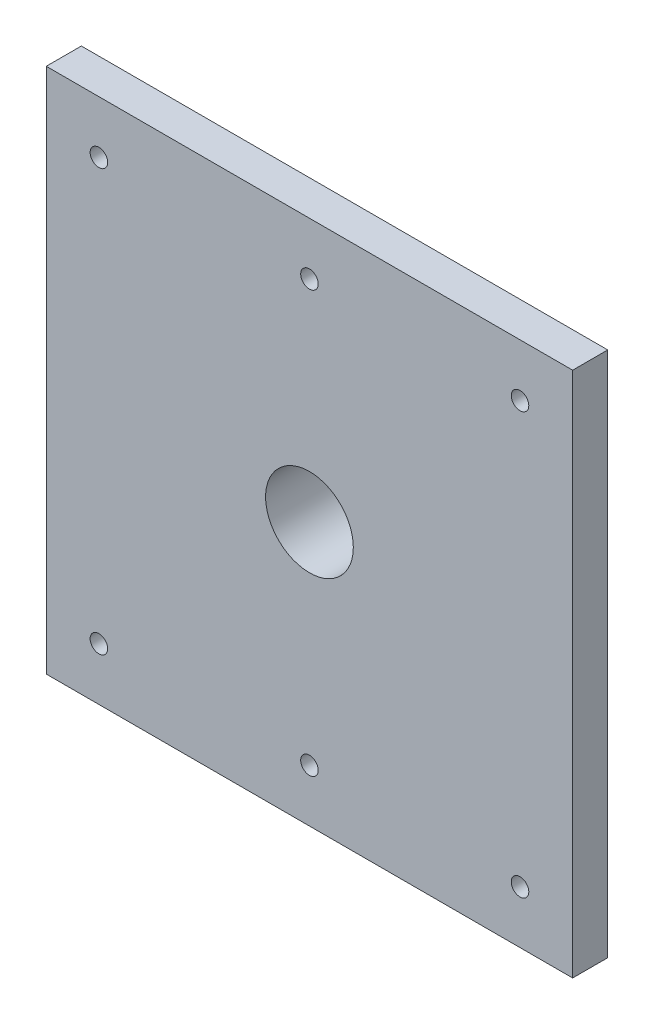
ISO-10303-21;
HEADER;
FILE_DESCRIPTION(('STEP AP214'),'2;1');
FILE_NAME('part.step','',(''),(''),'','','');
FILE_SCHEMA(('AUTOMOTIVE_DESIGN { 1 0 10303 214 1 1 1 1 }'));
ENDSEC;
DATA;
#1=APPLICATION_CONTEXT('core data for automotive mechanical design processes');
#2=APPLICATION_PROTOCOL_DEFINITION('international standard','automotive_design',2000,#1);
#3=PRODUCT_CONTEXT('',#1,'mechanical');
#4=PRODUCT('Part','Part','',(#3));
#5=PRODUCT_RELATED_PRODUCT_CATEGORY('part','',(#4));
#6=PRODUCT_DEFINITION_FORMATION('','',#4);
#7=PRODUCT_DEFINITION_CONTEXT('part definition',#1,'design');
#8=PRODUCT_DEFINITION('design','',#6,#7);
#9=PRODUCT_DEFINITION_SHAPE('','',#8);
#10=(LENGTH_UNIT() NAMED_UNIT(*) SI_UNIT(.MILLI.,.METRE.));
#11=(NAMED_UNIT(*) PLANE_ANGLE_UNIT() SI_UNIT($,.RADIAN.));
#12=(NAMED_UNIT(*) SI_UNIT($,.STERADIAN.) SOLID_ANGLE_UNIT());
#13=UNCERTAINTY_MEASURE_WITH_UNIT(LENGTH_MEASURE(1.E-05),#10,'distance_accuracy_value','');
#14=(GEOMETRIC_REPRESENTATION_CONTEXT(3) GLOBAL_UNCERTAINTY_ASSIGNED_CONTEXT((#13)) GLOBAL_UNIT_ASSIGNED_CONTEXT((#10,
#11,#12)) REPRESENTATION_CONTEXT('',''));
#15=CARTESIAN_POINT('',(0.,0.,0.));
#16=DIRECTION('',(0.,0.,1.));
#17=DIRECTION('',(1.,0.,0.));
#18=AXIS2_PLACEMENT_3D('',#15,#16,#17);
#19=CARTESIAN_POINT('',(0.,0.,-15.));
#20=DIRECTION('',(0.,0.,1.));
#21=DIRECTION('',(1.,0.,0.));
#22=AXIS2_PLACEMENT_3D('',#19,#20,#21);
#23=CYLINDRICAL_SURFACE('',#22,14.5);
#24=CARTESIAN_POINT('',(0.,0.,-15.));
#25=DIRECTION('',(0.,0.,1.));
#26=DIRECTION('',(1.,0.,0.));
#27=AXIS2_PLACEMENT_3D('',#24,#25,#26);
#28=CIRCLE('',#27,14.5);
#29=CARTESIAN_POINT('',(14.5,0.,-15.));
#30=VERTEX_POINT('',#29);
#31=EDGE_CURVE('E12',#30,#30,#28,.T.);
#32=ORIENTED_EDGE('',*,*,#31,.T.);
#33=EDGE_LOOP('',(#32));
#34=FACE_BOUND('',#33,.T.);
#35=CARTESIAN_POINT('',(0.,0.,0.));
#36=DIRECTION('',(0.,0.,1.));
#37=DIRECTION('',(1.,0.,0.));
#38=AXIS2_PLACEMENT_3D('',#35,#36,#37);
#39=CIRCLE('',#38,14.5);
#40=CARTESIAN_POINT('',(14.5,0.,0.));
#41=VERTEX_POINT('',#40);
#42=EDGE_CURVE('E45',#41,#41,#39,.T.);
#43=ORIENTED_EDGE('',*,*,#42,.F.);
#44=EDGE_LOOP('',(#43));
#45=FACE_BOUND('',#44,.T.);
#46=ADVANCED_FACE('F42',(#34,#45),#23,.T.);
#47=CARTESIAN_POINT('',(0.,0.,-15.));
#48=DIRECTION('',(0.,0.,1.));
#49=DIRECTION('',(1.,0.,0.));
#50=AXIS2_PLACEMENT_3D('',#47,#48,#49);
#51=PLANE('',#50);
#52=CARTESIAN_POINT('',(0.,0.,-15.));
#53=DIRECTION('',(0.,0.,1.));
#54=DIRECTION('',(1.,0.,0.));
#55=AXIS2_PLACEMENT_3D('',#52,#53,#54);
#56=CIRCLE('',#55,12.5);
#57=CARTESIAN_POINT('',(12.5,0.,-15.));
#58=VERTEX_POINT('',#57);
#59=EDGE_CURVE('E120',#58,#58,#56,.T.);
#60=ORIENTED_EDGE('',*,*,#59,.T.);
#61=EDGE_LOOP('',(#60));
#62=FACE_BOUND('',#61,.T.);
#63=ORIENTED_EDGE('',*,*,#31,.F.);
#64=EDGE_LOOP('',(#63));
#65=FACE_BOUND('',#64,.T.);
#66=ADVANCED_FACE('F131',(#62,#65),#51,.F.);
#67=CARTESIAN_POINT('',(0.,0.,-15.));
#68=DIRECTION('',(0.,0.,1.));
#69=DIRECTION('',(1.,0.,0.));
#70=AXIS2_PLACEMENT_3D('',#67,#68,#69);
#71=CYLINDRICAL_SURFACE('',#70,12.5);
#72=ORIENTED_EDGE('',*,*,#59,.F.);
#73=EDGE_LOOP('',(#72));
#74=FACE_BOUND('',#73,.T.);
#75=CARTESIAN_POINT('',(0.,0.,10.));
#76=DIRECTION('',(0.,0.,1.));
#77=DIRECTION('',(1.,0.,0.));
#78=AXIS2_PLACEMENT_3D('',#75,#76,#77);
#79=CIRCLE('',#78,12.5);
#80=CARTESIAN_POINT('',(12.5,0.,10.));
#81=VERTEX_POINT('',#80);
#82=EDGE_CURVE('E113',#81,#81,#79,.T.);
#83=ORIENTED_EDGE('',*,*,#82,.T.);
#84=EDGE_LOOP('',(#83));
#85=FACE_BOUND('',#84,.T.);
#86=ADVANCED_FACE('F136',(#74,#85),#71,.F.);
#87=CARTESIAN_POINT('',(0.,0.,10.));
#88=DIRECTION('',(0.,0.,-1.));
#89=DIRECTION('',(-1.,0.,0.));
#90=AXIS2_PLACEMENT_3D('',#87,#88,#89);
#91=PLANE('',#90);
#92=CARTESIAN_POINT('',(-60.,-60.,10.));
#93=DIRECTION('',(0.,0.,1.));
#94=DIRECTION('',(1.,0.,0.));
#95=AXIS2_PLACEMENT_3D('',#92,#93,#94);
#96=CIRCLE('',#95,2.5);
#97=CARTESIAN_POINT('',(-57.5,-60.,10.));
#98=VERTEX_POINT('',#97);
#99=EDGE_CURVE('E220',#98,#98,#96,.T.);
#100=ORIENTED_EDGE('',*,*,#99,.F.);
#101=EDGE_LOOP('',(#100));
#102=FACE_BOUND('',#101,.T.);
#103=CARTESIAN_POINT('',(0.,-60.,10.));
#104=DIRECTION('',(0.,0.,1.));
#105=DIRECTION('',(1.,0.,0.));
#106=AXIS2_PLACEMENT_3D('',#103,#104,#105);
#107=CIRCLE('',#106,2.5);
#108=CARTESIAN_POINT('',(2.5,-60.,10.));
#109=VERTEX_POINT('',#108);
#110=EDGE_CURVE('E214',#109,#109,#107,.T.);
#111=ORIENTED_EDGE('',*,*,#110,.F.);
#112=EDGE_LOOP('',(#111));
#113=FACE_BOUND('',#112,.T.);
#114=CARTESIAN_POINT('',(60.,-60.,10.));
#115=DIRECTION('',(0.,0.,1.));
#116=DIRECTION('',(1.,0.,0.));
#117=AXIS2_PLACEMENT_3D('',#114,#115,#116);
#118=CIRCLE('',#117,2.5);
#119=CARTESIAN_POINT('',(62.5,-60.,10.));
#120=VERTEX_POINT('',#119);
#121=EDGE_CURVE('E208',#120,#120,#118,.T.);
#122=ORIENTED_EDGE('',*,*,#121,.F.);
#123=EDGE_LOOP('',(#122));
#124=FACE_BOUND('',#123,.T.);
#125=CARTESIAN_POINT('',(60.,60.,10.));
#126=DIRECTION('',(0.,0.,1.));
#127=DIRECTION('',(1.,0.,0.));
#128=AXIS2_PLACEMENT_3D('',#125,#126,#127);
#129=CIRCLE('',#128,2.5);
#130=CARTESIAN_POINT('',(62.5,60.,10.));
#131=VERTEX_POINT('',#130);
#132=EDGE_CURVE('E200',#131,#131,#129,.T.);
#133=ORIENTED_EDGE('',*,*,#132,.F.);
#134=EDGE_LOOP('',(#133));
#135=FACE_BOUND('',#134,.T.);
#136=CARTESIAN_POINT('',(0.,60.,10.));
#137=DIRECTION('',(0.,0.,1.));
#138=DIRECTION('',(1.,0.,0.));
#139=AXIS2_PLACEMENT_3D('',#136,#137,#138);
#140=CIRCLE('',#139,2.5);
#141=CARTESIAN_POINT('',(2.5,60.,10.));
#142=VERTEX_POINT('',#141);
#143=EDGE_CURVE('E193',#142,#142,#140,.T.);
#144=ORIENTED_EDGE('',*,*,#143,.F.);
#145=EDGE_LOOP('',(#144));
#146=FACE_BOUND('',#145,.T.);
#147=CARTESIAN_POINT('',(-60.,60.,10.));
#148=DIRECTION('',(0.,0.,1.));
#149=DIRECTION('',(1.,0.,0.));
#150=AXIS2_PLACEMENT_3D('',#147,#148,#149);
#151=CIRCLE('',#150,2.5);
#152=CARTESIAN_POINT('',(-57.5,60.,10.));
#153=VERTEX_POINT('',#152);
#154=EDGE_CURVE('E197',#153,#153,#151,.T.);
#155=ORIENTED_EDGE('',*,*,#154,.F.);
#156=EDGE_LOOP('',(#155));
#157=FACE_BOUND('',#156,.T.);
#158=DIRECTION('',(0.,-1.,0.));
#159=VECTOR('',#158,1.);
#160=CARTESIAN_POINT('',(-75.,75.,10.));
#161=LINE('',#160,#159);
#162=CARTESIAN_POINT('',(-75.,75.,10.));
#163=VERTEX_POINT('',#162);
#164=CARTESIAN_POINT('',(-75.,-75.,10.));
#165=VERTEX_POINT('',#164);
#166=EDGE_CURVE('E95',#163,#165,#161,.T.);
#167=ORIENTED_EDGE('',*,*,#166,.T.);
#168=DIRECTION('',(1.,0.,0.));
#169=VECTOR('',#168,1.);
#170=CARTESIAN_POINT('',(75.,-75.,10.));
#171=LINE('',#170,#169);
#172=CARTESIAN_POINT('',(75.,-75.,10.));
#173=VERTEX_POINT('',#172);
#174=EDGE_CURVE('E89',#165,#173,#171,.T.);
#175=ORIENTED_EDGE('',*,*,#174,.T.);
#176=DIRECTION('',(0.,1.,0.));
#177=VECTOR('',#176,1.);
#178=CARTESIAN_POINT('',(75.,75.,10.));
#179=LINE('',#178,#177);
#180=CARTESIAN_POINT('',(75.,75.,10.));
#181=VERTEX_POINT('',#180);
#182=EDGE_CURVE('E93',#173,#181,#179,.T.);
#183=ORIENTED_EDGE('',*,*,#182,.T.);
#184=DIRECTION('',(-1.,0.,0.));
#185=VECTOR('',#184,1.);
#186=CARTESIAN_POINT('',(75.,75.,10.));
#187=LINE('',#186,#185);
#188=EDGE_CURVE('E58',#181,#163,#187,.T.);
#189=ORIENTED_EDGE('',*,*,#188,.T.);
#190=EDGE_LOOP('',(#167,#175,#183,#189));
#191=FACE_BOUND('',#190,.T.);
#192=ORIENTED_EDGE('',*,*,#82,.F.);
#193=EDGE_LOOP('',(#192));
#194=FACE_BOUND('',#193,.T.);
#195=ADVANCED_FACE('F90',(#102,#113,#124,#135,#146,#157,#191,#194),#91,.F.);
#196=CARTESIAN_POINT('',(0.,0.,0.));
#197=DIRECTION('',(0.,0.,-1.));
#198=DIRECTION('',(-1.,0.,0.));
#199=AXIS2_PLACEMENT_3D('',#196,#197,#198);
#200=PLANE('',#199);
#201=CARTESIAN_POINT('',(-60.,-60.,0.));
#202=DIRECTION('',(0.,0.,1.));
#203=DIRECTION('',(1.,0.,0.));
#204=AXIS2_PLACEMENT_3D('',#201,#202,#203);
#205=CIRCLE('',#204,2.5);
#206=CARTESIAN_POINT('',(-57.5,-60.,0.));
#207=VERTEX_POINT('',#206);
#208=EDGE_CURVE('E217',#207,#207,#205,.T.);
#209=ORIENTED_EDGE('',*,*,#208,.T.);
#210=EDGE_LOOP('',(#209));
#211=FACE_BOUND('',#210,.T.);
#212=CARTESIAN_POINT('',(0.,-60.,0.));
#213=DIRECTION('',(0.,0.,1.));
#214=DIRECTION('',(1.,0.,0.));
#215=AXIS2_PLACEMENT_3D('',#212,#213,#214);
#216=CIRCLE('',#215,2.5);
#217=CARTESIAN_POINT('',(2.5,-60.,0.));
#218=VERTEX_POINT('',#217);
#219=EDGE_CURVE('E211',#218,#218,#216,.T.);
#220=ORIENTED_EDGE('',*,*,#219,.T.);
#221=EDGE_LOOP('',(#220));
#222=FACE_BOUND('',#221,.T.);
#223=CARTESIAN_POINT('',(60.,-60.,0.));
#224=DIRECTION('',(0.,0.,1.));
#225=DIRECTION('',(1.,0.,0.));
#226=AXIS2_PLACEMENT_3D('',#223,#224,#225);
#227=CIRCLE('',#226,2.5);
#228=CARTESIAN_POINT('',(62.5,-60.,0.));
#229=VERTEX_POINT('',#228);
#230=EDGE_CURVE('E205',#229,#229,#227,.T.);
#231=ORIENTED_EDGE('',*,*,#230,.T.);
#232=EDGE_LOOP('',(#231));
#233=FACE_BOUND('',#232,.T.);
#234=CARTESIAN_POINT('',(60.,60.,0.));
#235=DIRECTION('',(0.,0.,1.));
#236=DIRECTION('',(1.,0.,0.));
#237=AXIS2_PLACEMENT_3D('',#234,#235,#236);
#238=CIRCLE('',#237,2.5);
#239=CARTESIAN_POINT('',(62.5,60.,0.));
#240=VERTEX_POINT('',#239);
#241=EDGE_CURVE('E195',#240,#240,#238,.T.);
#242=ORIENTED_EDGE('',*,*,#241,.T.);
#243=EDGE_LOOP('',(#242));
#244=FACE_BOUND('',#243,.T.);
#245=CARTESIAN_POINT('',(0.,60.,0.));
#246=DIRECTION('',(0.,0.,1.));
#247=DIRECTION('',(1.,0.,0.));
#248=AXIS2_PLACEMENT_3D('',#245,#246,#247);
#249=CIRCLE('',#248,2.5);
#250=CARTESIAN_POINT('',(2.5,60.,0.));
#251=VERTEX_POINT('',#250);
#252=EDGE_CURVE('E190',#251,#251,#249,.T.);
#253=ORIENTED_EDGE('',*,*,#252,.T.);
#254=EDGE_LOOP('',(#253));
#255=FACE_BOUND('',#254,.T.);
#256=CARTESIAN_POINT('',(-60.,60.,0.));
#257=DIRECTION('',(0.,0.,1.));
#258=DIRECTION('',(1.,0.,0.));
#259=AXIS2_PLACEMENT_3D('',#256,#257,#258);
#260=CIRCLE('',#259,2.5);
#261=CARTESIAN_POINT('',(-57.5,60.,0.));
#262=VERTEX_POINT('',#261);
#263=EDGE_CURVE('E223',#262,#262,#260,.T.);
#264=ORIENTED_EDGE('',*,*,#263,.T.);
#265=EDGE_LOOP('',(#264));
#266=FACE_BOUND('',#265,.T.);
#267=ORIENTED_EDGE('',*,*,#42,.T.);
#268=EDGE_LOOP('',(#267));
#269=FACE_BOUND('',#268,.T.);
#270=DIRECTION('',(0.,-1.,0.));
#271=VECTOR('',#270,1.);
#272=CARTESIAN_POINT('',(-75.,75.,0.));
#273=LINE('',#272,#271);
#274=CARTESIAN_POINT('',(-75.,75.,0.));
#275=VERTEX_POINT('',#274);
#276=CARTESIAN_POINT('',(-75.,-75.,0.));
#277=VERTEX_POINT('',#276);
#278=EDGE_CURVE('E110',#275,#277,#273,.T.);
#279=ORIENTED_EDGE('',*,*,#278,.F.);
#280=DIRECTION('',(-1.,0.,0.));
#281=VECTOR('',#280,1.);
#282=CARTESIAN_POINT('',(75.,75.,0.));
#283=LINE('',#282,#281);
#284=CARTESIAN_POINT('',(75.,75.,0.));
#285=VERTEX_POINT('',#284);
#286=EDGE_CURVE('E81',#285,#275,#283,.T.);
#287=ORIENTED_EDGE('',*,*,#286,.F.);
#288=DIRECTION('',(0.,1.,0.));
#289=VECTOR('',#288,1.);
#290=CARTESIAN_POINT('',(75.,75.,0.));
#291=LINE('',#290,#289);
#292=CARTESIAN_POINT('',(75.,-75.,0.));
#293=VERTEX_POINT('',#292);
#294=EDGE_CURVE('E75',#293,#285,#291,.T.);
#295=ORIENTED_EDGE('',*,*,#294,.F.);
#296=DIRECTION('',(1.,0.,0.));
#297=VECTOR('',#296,1.);
#298=CARTESIAN_POINT('',(75.,-75.,0.));
#299=LINE('',#298,#297);
#300=EDGE_CURVE('E100',#277,#293,#299,.T.);
#301=ORIENTED_EDGE('',*,*,#300,.F.);
#302=EDGE_LOOP('',(#279,#287,#295,#301));
#303=FACE_BOUND('',#302,.T.);
#304=ADVANCED_FACE('F127',(#211,#222,#233,#244,#255,#266,#269,#303),#200,.T.);
#305=CARTESIAN_POINT('',(-75.,75.,10.));
#306=DIRECTION('',(1.,0.,0.));
#307=DIRECTION('',(0.,0.,-1.));
#308=AXIS2_PLACEMENT_3D('',#305,#306,#307);
#309=PLANE('',#308);
#310=ORIENTED_EDGE('',*,*,#278,.T.);
#311=DIRECTION('',(0.,0.,-1.));
#312=VECTOR('',#311,1.);
#313=CARTESIAN_POINT('',(-75.,-75.,10.));
#314=LINE('',#313,#312);
#315=EDGE_CURVE('E101',#165,#277,#314,.T.);
#316=ORIENTED_EDGE('',*,*,#315,.F.);
#317=ORIENTED_EDGE('',*,*,#166,.F.);
#318=DIRECTION('',(0.,0.,-1.));
#319=VECTOR('',#318,1.);
#320=CARTESIAN_POINT('',(-75.,75.,10.));
#321=LINE('',#320,#319);
#322=EDGE_CURVE('E106',#163,#275,#321,.T.);
#323=ORIENTED_EDGE('',*,*,#322,.T.);
#324=EDGE_LOOP('',(#310,#316,#317,#323));
#325=FACE_BOUND('',#324,.T.);
#326=ADVANCED_FACE('F145',(#325),#309,.F.);
#327=CARTESIAN_POINT('',(75.,-75.,10.));
#328=DIRECTION('',(0.,1.,0.));
#329=DIRECTION('',(0.,0.,1.));
#330=AXIS2_PLACEMENT_3D('',#327,#328,#329);
#331=PLANE('',#330);
#332=ORIENTED_EDGE('',*,*,#300,.T.);
#333=DIRECTION('',(0.,0.,-1.));
#334=VECTOR('',#333,1.);
#335=CARTESIAN_POINT('',(75.,-75.,10.));
#336=LINE('',#335,#334);
#337=EDGE_CURVE('E98',#173,#293,#336,.T.);
#338=ORIENTED_EDGE('',*,*,#337,.F.);
#339=ORIENTED_EDGE('',*,*,#174,.F.);
#340=ORIENTED_EDGE('',*,*,#315,.T.);
#341=EDGE_LOOP('',(#332,#338,#339,#340));
#342=FACE_BOUND('',#341,.T.);
#343=ADVANCED_FACE('F99',(#342),#331,.F.);
#344=CARTESIAN_POINT('',(75.,75.,10.));
#345=DIRECTION('',(-1.,0.,0.));
#346=DIRECTION('',(0.,0.,1.));
#347=AXIS2_PLACEMENT_3D('',#344,#345,#346);
#348=PLANE('',#347);
#349=ORIENTED_EDGE('',*,*,#294,.T.);
#350=DIRECTION('',(0.,0.,-1.));
#351=VECTOR('',#350,1.);
#352=CARTESIAN_POINT('',(75.,75.,10.));
#353=LINE('',#352,#351);
#354=EDGE_CURVE('E102',#181,#285,#353,.T.);
#355=ORIENTED_EDGE('',*,*,#354,.F.);
#356=ORIENTED_EDGE('',*,*,#182,.F.);
#357=ORIENTED_EDGE('',*,*,#337,.T.);
#358=EDGE_LOOP('',(#349,#355,#356,#357));
#359=FACE_BOUND('',#358,.T.);
#360=ADVANCED_FACE('F104',(#359),#348,.F.);
#361=CARTESIAN_POINT('',(75.,75.,10.));
#362=DIRECTION('',(0.,-1.,0.));
#363=DIRECTION('',(0.,0.,-1.));
#364=AXIS2_PLACEMENT_3D('',#361,#362,#363);
#365=PLANE('',#364);
#366=ORIENTED_EDGE('',*,*,#286,.T.);
#367=ORIENTED_EDGE('',*,*,#322,.F.);
#368=ORIENTED_EDGE('',*,*,#188,.F.);
#369=ORIENTED_EDGE('',*,*,#354,.T.);
#370=EDGE_LOOP('',(#366,#367,#368,#369));
#371=FACE_BOUND('',#370,.T.);
#372=ADVANCED_FACE('F153',(#371),#365,.F.);
#373=CARTESIAN_POINT('',(-60.,60.,0.));
#374=DIRECTION('',(0.,0.,1.));
#375=DIRECTION('',(1.,0.,0.));
#376=AXIS2_PLACEMENT_3D('',#373,#374,#375);
#377=CYLINDRICAL_SURFACE('',#376,2.5);
#378=ORIENTED_EDGE('',*,*,#263,.F.);
#379=EDGE_LOOP('',(#378));
#380=FACE_BOUND('',#379,.T.);
#381=ORIENTED_EDGE('',*,*,#154,.T.);
#382=EDGE_LOOP('',(#381));
#383=FACE_BOUND('',#382,.T.);
#384=ADVANCED_FACE('F156',(#380,#383),#377,.F.);
#385=CARTESIAN_POINT('',(0.,60.,0.));
#386=DIRECTION('',(0.,0.,1.));
#387=DIRECTION('',(1.,0.,0.));
#388=AXIS2_PLACEMENT_3D('',#385,#386,#387);
#389=CYLINDRICAL_SURFACE('',#388,2.5);
#390=ORIENTED_EDGE('',*,*,#252,.F.);
#391=EDGE_LOOP('',(#390));
#392=FACE_BOUND('',#391,.T.);
#393=ORIENTED_EDGE('',*,*,#143,.T.);
#394=EDGE_LOOP('',(#393));
#395=FACE_BOUND('',#394,.T.);
#396=ADVANCED_FACE('F165',(#392,#395),#389,.F.);
#397=CARTESIAN_POINT('',(60.,60.,0.));
#398=DIRECTION('',(0.,0.,1.));
#399=DIRECTION('',(1.,0.,0.));
#400=AXIS2_PLACEMENT_3D('',#397,#398,#399);
#401=CYLINDRICAL_SURFACE('',#400,2.5);
#402=ORIENTED_EDGE('',*,*,#241,.F.);
#403=EDGE_LOOP('',(#402));
#404=FACE_BOUND('',#403,.T.);
#405=ORIENTED_EDGE('',*,*,#132,.T.);
#406=EDGE_LOOP('',(#405));
#407=FACE_BOUND('',#406,.T.);
#408=ADVANCED_FACE('F178',(#404,#407),#401,.F.);
#409=CARTESIAN_POINT('',(60.,-60.,0.));
#410=DIRECTION('',(0.,0.,1.));
#411=DIRECTION('',(1.,0.,0.));
#412=AXIS2_PLACEMENT_3D('',#409,#410,#411);
#413=CYLINDRICAL_SURFACE('',#412,2.5);
#414=ORIENTED_EDGE('',*,*,#230,.F.);
#415=EDGE_LOOP('',(#414));
#416=FACE_BOUND('',#415,.T.);
#417=ORIENTED_EDGE('',*,*,#121,.T.);
#418=EDGE_LOOP('',(#417));
#419=FACE_BOUND('',#418,.T.);
#420=ADVANCED_FACE('F174',(#416,#419),#413,.F.);
#421=CARTESIAN_POINT('',(0.,-60.,0.));
#422=DIRECTION('',(0.,0.,1.));
#423=DIRECTION('',(1.,0.,0.));
#424=AXIS2_PLACEMENT_3D('',#421,#422,#423);
#425=CYLINDRICAL_SURFACE('',#424,2.5);
#426=ORIENTED_EDGE('',*,*,#219,.F.);
#427=EDGE_LOOP('',(#426));
#428=FACE_BOUND('',#427,.T.);
#429=ORIENTED_EDGE('',*,*,#110,.T.);
#430=EDGE_LOOP('',(#429));
#431=FACE_BOUND('',#430,.T.);
#432=ADVANCED_FACE('F170',(#428,#431),#425,.F.);
#433=CARTESIAN_POINT('',(-60.,-60.,0.));
#434=DIRECTION('',(0.,0.,1.));
#435=DIRECTION('',(1.,0.,0.));
#436=AXIS2_PLACEMENT_3D('',#433,#434,#435);
#437=CYLINDRICAL_SURFACE('',#436,2.5);
#438=ORIENTED_EDGE('',*,*,#208,.F.);
#439=EDGE_LOOP('',(#438));
#440=FACE_BOUND('',#439,.T.);
#441=ORIENTED_EDGE('',*,*,#99,.T.);
#442=EDGE_LOOP('',(#441));
#443=FACE_BOUND('',#442,.T.);
#444=ADVANCED_FACE('F167',(#440,#443),#437,.F.);
#445=CLOSED_SHELL('',(#46,#66,#86,#195,#304,#326,#343,#360,#372,#384,#396,#408,#420,#432,#444));
#446=MANIFOLD_SOLID_BREP('B2',#445);
#447=ADVANCED_BREP_SHAPE_REPRESENTATION('',(#18,#446),#14);
#448=SHAPE_DEFINITION_REPRESENTATION(#9,#447);
ENDSEC;
END-ISO-10303-21;
